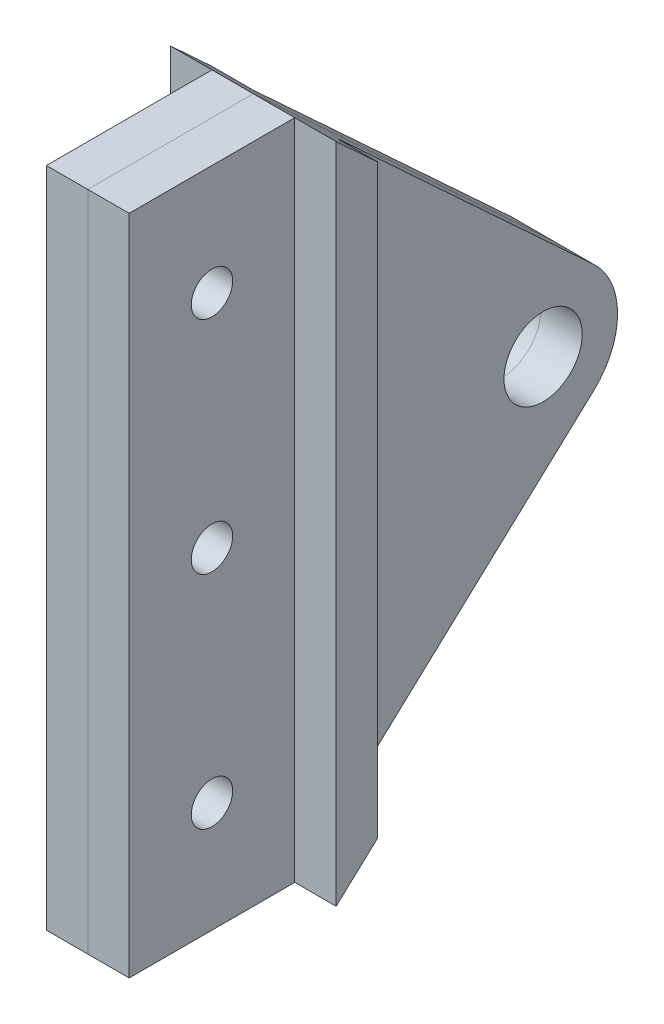
ISO-10303-21;
HEADER;
FILE_DESCRIPTION(('STEP AP214'),'2;1');
FILE_NAME('part.step','',(''),(''),'','','');
FILE_SCHEMA(('AUTOMOTIVE_DESIGN { 1 0 10303 214 1 1 1 1 }'));
ENDSEC;
DATA;
#1=APPLICATION_CONTEXT('core data for automotive mechanical design processes');
#2=APPLICATION_PROTOCOL_DEFINITION('international standard','automotive_design',2000,#1);
#3=PRODUCT_CONTEXT('',#1,'mechanical');
#4=PRODUCT('Part','Part','',(#3));
#5=PRODUCT_RELATED_PRODUCT_CATEGORY('part','',(#4));
#6=PRODUCT_DEFINITION_FORMATION('','',#4);
#7=PRODUCT_DEFINITION_CONTEXT('part definition',#1,'design');
#8=PRODUCT_DEFINITION('design','',#6,#7);
#9=PRODUCT_DEFINITION_SHAPE('','',#8);
#10=(LENGTH_UNIT() NAMED_UNIT(*) SI_UNIT(.MILLI.,.METRE.));
#11=(NAMED_UNIT(*) PLANE_ANGLE_UNIT() SI_UNIT($,.RADIAN.));
#12=(NAMED_UNIT(*) SI_UNIT($,.STERADIAN.) SOLID_ANGLE_UNIT());
#13=UNCERTAINTY_MEASURE_WITH_UNIT(LENGTH_MEASURE(1.E-05),#10,'distance_accuracy_value','');
#14=(GEOMETRIC_REPRESENTATION_CONTEXT(3) GLOBAL_UNCERTAINTY_ASSIGNED_CONTEXT((#13)) GLOBAL_UNIT_ASSIGNED_CONTEXT((#10,
#11,#12)) REPRESENTATION_CONTEXT('',''));
#15=CARTESIAN_POINT('',(0.,0.,0.));
#16=DIRECTION('',(0.,0.,1.));
#17=DIRECTION('',(1.,0.,0.));
#18=AXIS2_PLACEMENT_3D('',#15,#16,#17);
#19=CARTESIAN_POINT('',(-6.35,0.,0.));
#20=DIRECTION('',(-1.,0.,0.));
#21=DIRECTION('',(0.,0.,-1.));
#22=AXIS2_PLACEMENT_3D('',#19,#20,#21);
#23=PLANE('',#22);
#24=CARTESIAN_POINT('',(-6.35,62.6297688444484,-1343.57742326432));
#25=DIRECTION('',(1.,0.,0.));
#26=DIRECTION('',(0.,0.,-1.));
#27=AXIS2_PLACEMENT_3D('',#24,#25,#26);
#28=CIRCLE('',#27,3.17499999999986);
#29=CARTESIAN_POINT('',(-6.35,62.6297688444484,-1346.75242326432));
#30=VERTEX_POINT('',#29);
#31=EDGE_CURVE('E238',#30,#30,#28,.F.);
#32=ORIENTED_EDGE('',*,*,#31,.F.);
#33=EDGE_LOOP('',(#32));
#34=FACE_BOUND('',#33,.T.);
#35=CARTESIAN_POINT('',(-6.35,130.363102177782,-1343.57742326432));
#36=DIRECTION('',(1.,0.,0.));
#37=DIRECTION('',(0.,0.,-1.));
#38=AXIS2_PLACEMENT_3D('',#35,#36,#37);
#39=CIRCLE('',#38,3.17499999999986);
#40=CARTESIAN_POINT('',(-6.35,130.363102177782,-1346.75242326432));
#41=VERTEX_POINT('',#40);
#42=EDGE_CURVE('E440',#41,#41,#39,.T.);
#43=ORIENTED_EDGE('',*,*,#42,.T.);
#44=EDGE_LOOP('',(#43));
#45=FACE_BOUND('',#44,.T.);
#46=CARTESIAN_POINT('',(-6.35,96.4964355111151,-1343.57742326432));
#47=DIRECTION('',(1.,0.,0.));
#48=DIRECTION('',(0.,0.,-1.));
#49=AXIS2_PLACEMENT_3D('',#46,#47,#48);
#50=CIRCLE('',#49,3.17499999999986);
#51=CARTESIAN_POINT('',(-6.35,96.4964355111151,-1346.75242326432));
#52=VERTEX_POINT('',#51);
#53=EDGE_CURVE('E160',#52,#52,#50,.T.);
#54=ORIENTED_EDGE('',*,*,#53,.T.);
#55=EDGE_LOOP('',(#54));
#56=FACE_BOUND('',#55,.T.);
#57=DIRECTION('',(0.,0.,-1.));
#58=VECTOR('',#57,1.);
#59=CARTESIAN_POINT('',(-6.35,45.6964355111143,0.));
#60=LINE('',#59,#58);
#61=CARTESIAN_POINT('',(-6.35,45.6964355111151,-1330.87742326432));
#62=VERTEX_POINT('',#61);
#63=CARTESIAN_POINT('',(-6.35,45.6964355111151,-1356.27742326432));
#64=VERTEX_POINT('',#63);
#65=EDGE_CURVE('E128',#62,#64,#60,.T.);
#66=ORIENTED_EDGE('',*,*,#65,.F.);
#67=DIRECTION('',(0.,-1.,0.));
#68=VECTOR('',#67,1.);
#69=CARTESIAN_POINT('',(-6.35,0.,-1330.87742326432));
#70=LINE('',#69,#68);
#71=CARTESIAN_POINT('',(-6.35,147.296435511115,-1330.87742326432));
#72=VERTEX_POINT('',#71);
#73=EDGE_CURVE('E137',#72,#62,#70,.T.);
#74=ORIENTED_EDGE('',*,*,#73,.F.);
#75=DIRECTION('',(0.,0.,1.));
#76=VECTOR('',#75,1.);
#77=CARTESIAN_POINT('',(-6.35,147.296435511115,0.));
#78=LINE('',#77,#76);
#79=CARTESIAN_POINT('',(-6.35,147.296435511115,-1356.27742326432));
#80=VERTEX_POINT('',#79);
#81=EDGE_CURVE('E144',#80,#72,#78,.T.);
#82=ORIENTED_EDGE('',*,*,#81,.F.);
#83=DIRECTION('',(0.,1.,0.));
#84=VECTOR('',#83,1.);
#85=CARTESIAN_POINT('',(-6.35,0.,-1356.27742326432));
#86=LINE('',#85,#84);
#87=EDGE_CURVE('E148',#64,#80,#86,.T.);
#88=ORIENTED_EDGE('',*,*,#87,.F.);
#89=EDGE_LOOP('',(#66,#74,#82,#88));
#90=FACE_BOUND('',#89,.T.);
#91=ADVANCED_FACE('F53',(#34,#45,#56,#90),#23,.T.);
#92=CARTESIAN_POINT('',(-6.35,96.4964355111151,-1394.37742326432));
#93=DIRECTION('',(1.,0.,0.));
#94=DIRECTION('',(0.,0.,1.));
#95=AXIS2_PLACEMENT_3D('',#92,#93,#94);
#96=CYLINDRICAL_SURFACE('',#95,11.4300000000001);
#97=CARTESIAN_POINT('',(0.,96.4964355111151,-1394.37742326432));
#98=DIRECTION('',(1.,0.,0.));
#99=DIRECTION('',(0.,0.,-1.));
#100=AXIS2_PLACEMENT_3D('',#97,#98,#99);
#101=CIRCLE('',#100,11.4300000000001);
#102=CARTESIAN_POINT('',(0.,88.1045298984414,-1402.13763074788));
#103=VERTEX_POINT('',#102);
#104=CARTESIAN_POINT('',(0.,104.888341123789,-1402.13763074788));
#105=VERTEX_POINT('',#104);
#106=EDGE_CURVE('E254',#103,#105,#101,.T.);
#107=ORIENTED_EDGE('',*,*,#106,.F.);
#108=DIRECTION('',(1.,0.,0.));
#109=VECTOR('',#108,1.);
#110=CARTESIAN_POINT('',(-6.35,88.1045298984414,-1402.13763074788));
#111=LINE('',#110,#109);
#112=CARTESIAN_POINT('',(-6.35,88.1045298984414,-1402.13763074788));
#113=VERTEX_POINT('',#112);
#114=EDGE_CURVE('E235',#113,#103,#111,.T.);
#115=ORIENTED_EDGE('',*,*,#114,.F.);
#116=CARTESIAN_POINT('',(-6.35,96.4964355111151,-1394.37742326432));
#117=DIRECTION('',(1.,0.,0.));
#118=DIRECTION('',(0.,0.,-1.));
#119=AXIS2_PLACEMENT_3D('',#116,#117,#118);
#120=CIRCLE('',#119,11.4300000000001);
#121=CARTESIAN_POINT('',(-6.35,104.888341123789,-1402.13763074788));
#122=VERTEX_POINT('',#121);
#123=EDGE_CURVE('E234',#113,#122,#120,.T.);
#124=ORIENTED_EDGE('',*,*,#123,.T.);
#125=DIRECTION('',(1.,0.,0.));
#126=VECTOR('',#125,1.);
#127=CARTESIAN_POINT('',(-6.35,104.888341123789,-1402.13763074788));
#128=LINE('',#127,#126);
#129=EDGE_CURVE('E12',#122,#105,#128,.T.);
#130=ORIENTED_EDGE('',*,*,#129,.T.);
#131=EDGE_LOOP('',(#107,#115,#124,#130));
#132=FACE_BOUND('',#131,.T.);
#133=ADVANCED_FACE('F55',(#132),#96,.T.);
#134=CARTESIAN_POINT('',(-6.35,755.467484096882,-698.599900221084));
#135=DIRECTION('',(0.,-0.73419996611318,0.678933288150909));
#136=DIRECTION('',(0.,-0.678933288150909,-0.73419996611318));
#137=AXIS2_PLACEMENT_3D('',#134,#135,#136);
#138=PLANE('',#137);
#139=DIRECTION('',(0.,0.678933288150909,0.73419996611318));
#140=VECTOR('',#139,1.);
#141=CARTESIAN_POINT('',(0.,755.467484096882,-698.599900221084));
#142=LINE('',#141,#140);
#143=CARTESIAN_POINT('',(0.,147.296435511115,-1356.27742326432));
#144=VERTEX_POINT('',#143);
#145=EDGE_CURVE('E247',#105,#144,#142,.T.);
#146=ORIENTED_EDGE('',*,*,#145,.F.);
#147=ORIENTED_EDGE('',*,*,#129,.F.);
#148=DIRECTION('',(0.,0.678933288150909,0.73419996611318));
#149=VECTOR('',#148,1.);
#150=CARTESIAN_POINT('',(-6.35,755.467484096882,-698.599900221084));
#151=LINE('',#150,#149);
#152=CARTESIAN_POINT('',(-6.35,141.424429819557,-1362.62742326432));
#153=VERTEX_POINT('',#152);
#154=EDGE_CURVE('E110',#122,#153,#151,.T.);
#155=ORIENTED_EDGE('',*,*,#154,.T.);
#156=DIRECTION('',(1.,0.,0.));
#157=VECTOR('',#156,1.);
#158=CARTESIAN_POINT('',(-12.7,141.424429819557,-1362.62742326432));
#159=LINE('',#158,#157);
#160=CARTESIAN_POINT('',(-12.7,141.424429819557,-1362.62742326432));
#161=VERTEX_POINT('',#160);
#162=EDGE_CURVE('E278',#161,#153,#159,.T.);
#163=ORIENTED_EDGE('',*,*,#162,.F.);
#164=DIRECTION('',(0.,0.678933288150909,0.73419996611318));
#165=VECTOR('',#164,1.);
#166=CARTESIAN_POINT('',(-12.7,755.467484096882,-698.599900221084));
#167=LINE('',#166,#165);
#168=CARTESIAN_POINT('',(-12.7,147.296435511115,-1356.27742326432));
#169=VERTEX_POINT('',#168);
#170=EDGE_CURVE('E297',#161,#169,#167,.T.);
#171=ORIENTED_EDGE('',*,*,#170,.T.);
#172=DIRECTION('',(1.,0.,0.));
#173=VECTOR('',#172,1.);
#174=CARTESIAN_POINT('',(-12.7,147.296435511115,-1356.27742326432));
#175=LINE('',#174,#173);
#176=EDGE_CURVE('E250',#169,#80,#175,.T.);
#177=ORIENTED_EDGE('',*,*,#176,.T.);
#178=DIRECTION('',(1.,0.,0.));
#179=VECTOR('',#178,1.);
#180=CARTESIAN_POINT('',(-6.35,147.296435511115,-1356.27742326432));
#181=LINE('',#180,#179);
#182=EDGE_CURVE('E64',#80,#144,#181,.T.);
#183=ORIENTED_EDGE('',*,*,#182,.T.);
#184=EDGE_LOOP('',(#146,#147,#155,#163,#171,#177,#183));
#185=FACE_BOUND('',#184,.T.);
#186=ADVANCED_FACE('F181',(#185),#138,.F.);
#187=CARTESIAN_POINT('',(-6.35,147.296435511115,0.));
#188=DIRECTION('',(0.,-1.,0.));
#189=DIRECTION('',(0.,0.,-1.));
#190=AXIS2_PLACEMENT_3D('',#187,#188,#189);
#191=PLANE('',#190);
#192=DIRECTION('',(0.,0.,1.));
#193=VECTOR('',#192,1.);
#194=CARTESIAN_POINT('',(0.,147.296435511115,0.));
#195=LINE('',#194,#193);
#196=CARTESIAN_POINT('',(0.,147.296435511115,-1330.87742326432));
#197=VERTEX_POINT('',#196);
#198=EDGE_CURVE('E252',#144,#197,#195,.T.);
#199=ORIENTED_EDGE('',*,*,#198,.F.);
#200=ORIENTED_EDGE('',*,*,#182,.F.);
#201=ORIENTED_EDGE('',*,*,#81,.T.);
#202=DIRECTION('',(1.,0.,0.));
#203=VECTOR('',#202,1.);
#204=CARTESIAN_POINT('',(-6.35,147.296435511115,-1330.87742326432));
#205=LINE('',#204,#203);
#206=EDGE_CURVE('E133',#72,#197,#205,.T.);
#207=ORIENTED_EDGE('',*,*,#206,.T.);
#208=EDGE_LOOP('',(#199,#200,#201,#207));
#209=FACE_BOUND('',#208,.T.);
#210=ADVANCED_FACE('F179',(#209),#191,.F.);
#211=CARTESIAN_POINT('',(-6.35,0.,-1330.87742326432));
#212=DIRECTION('',(0.,0.,-1.));
#213=DIRECTION('',(1.,0.,0.));
#214=AXIS2_PLACEMENT_3D('',#211,#212,#213);
#215=PLANE('',#214);
#216=DIRECTION('',(0.,-1.,0.));
#217=VECTOR('',#216,1.);
#218=CARTESIAN_POINT('',(0.,0.,-1330.87742326432));
#219=LINE('',#218,#217);
#220=CARTESIAN_POINT('',(0.,45.6964355111151,-1330.87742326432));
#221=VERTEX_POINT('',#220);
#222=EDGE_CURVE('E259',#197,#221,#219,.T.);
#223=ORIENTED_EDGE('',*,*,#222,.F.);
#224=ORIENTED_EDGE('',*,*,#206,.F.);
#225=ORIENTED_EDGE('',*,*,#73,.T.);
#226=DIRECTION('',(1.,0.,0.));
#227=VECTOR('',#226,1.);
#228=CARTESIAN_POINT('',(-6.35,45.6964355111151,-1330.87742326432));
#229=LINE('',#228,#227);
#230=EDGE_CURVE('E123',#62,#221,#229,.T.);
#231=ORIENTED_EDGE('',*,*,#230,.T.);
#232=EDGE_LOOP('',(#223,#224,#225,#231));
#233=FACE_BOUND('',#232,.T.);
#234=ADVANCED_FACE('F138',(#233),#215,.F.);
#235=CARTESIAN_POINT('',(-6.35,45.6964355111143,0.));
#236=DIRECTION('',(0.,1.,0.));
#237=DIRECTION('',(0.,0.,1.));
#238=AXIS2_PLACEMENT_3D('',#235,#236,#237);
#239=PLANE('',#238);
#240=DIRECTION('',(0.,0.,-1.));
#241=VECTOR('',#240,1.);
#242=CARTESIAN_POINT('',(0.,45.6964355111143,0.));
#243=LINE('',#242,#241);
#244=CARTESIAN_POINT('',(0.,45.6964355111151,-1356.27742326432));
#245=VERTEX_POINT('',#244);
#246=EDGE_CURVE('E129',#221,#245,#243,.T.);
#247=ORIENTED_EDGE('',*,*,#246,.F.);
#248=ORIENTED_EDGE('',*,*,#230,.F.);
#249=ORIENTED_EDGE('',*,*,#65,.T.);
#250=DIRECTION('',(1.,0.,0.));
#251=VECTOR('',#250,1.);
#252=CARTESIAN_POINT('',(-6.35,45.6964355111151,-1356.27742326432));
#253=LINE('',#252,#251);
#254=EDGE_CURVE('E134',#64,#245,#253,.T.);
#255=ORIENTED_EDGE('',*,*,#254,.T.);
#256=EDGE_LOOP('',(#247,#248,#249,#255));
#257=FACE_BOUND('',#256,.T.);
#258=ADVANCED_FACE('F125',(#257),#239,.F.);
#259=CARTESIAN_POINT('',(-6.35,130.363102177782,-1343.57742326432));
#260=DIRECTION('',(1.,0.,0.));
#261=DIRECTION('',(0.,0.,1.));
#262=AXIS2_PLACEMENT_3D('',#259,#260,#261);
#263=CYLINDRICAL_SURFACE('',#262,3.17499999999986);
#264=ORIENTED_EDGE('',*,*,#42,.F.);
#265=EDGE_LOOP('',(#264));
#266=FACE_BOUND('',#265,.T.);
#267=CARTESIAN_POINT('',(0.,130.363102177782,-1343.57742326432));
#268=DIRECTION('',(1.,0.,0.));
#269=DIRECTION('',(0.,0.,-1.));
#270=AXIS2_PLACEMENT_3D('',#267,#268,#269);
#271=CIRCLE('',#270,3.17499999999986);
#272=CARTESIAN_POINT('',(0.,130.363102177782,-1346.75242326432));
#273=VERTEX_POINT('',#272);
#274=EDGE_CURVE('E221',#273,#273,#271,.T.);
#275=ORIENTED_EDGE('',*,*,#274,.T.);
#276=EDGE_LOOP('',(#275));
#277=FACE_BOUND('',#276,.T.);
#278=ADVANCED_FACE('F176',(#266,#277),#263,.F.);
#279=CARTESIAN_POINT('',(-6.35,96.4964355111151,-1343.57742326432));
#280=DIRECTION('',(1.,0.,0.));
#281=DIRECTION('',(0.,0.,1.));
#282=AXIS2_PLACEMENT_3D('',#279,#280,#281);
#283=CYLINDRICAL_SURFACE('',#282,3.17499999999986);
#284=ORIENTED_EDGE('',*,*,#53,.F.);
#285=EDGE_LOOP('',(#284));
#286=FACE_BOUND('',#285,.T.);
#287=CARTESIAN_POINT('',(0.,96.4964355111151,-1343.57742326432));
#288=DIRECTION('',(1.,0.,0.));
#289=DIRECTION('',(0.,0.,-1.));
#290=AXIS2_PLACEMENT_3D('',#287,#288,#289);
#291=CIRCLE('',#290,3.17499999999986);
#292=CARTESIAN_POINT('',(0.,96.4964355111151,-1346.75242326432));
#293=VERTEX_POINT('',#292);
#294=EDGE_CURVE('E216',#293,#293,#291,.T.);
#295=ORIENTED_EDGE('',*,*,#294,.T.);
#296=EDGE_LOOP('',(#295));
#297=FACE_BOUND('',#296,.T.);
#298=ADVANCED_FACE('F168',(#286,#297),#283,.F.);
#299=CARTESIAN_POINT('',(-6.35,96.4964355111151,-1394.37742326432));
#300=DIRECTION('',(1.,0.,0.));
#301=DIRECTION('',(0.,0.,1.));
#302=AXIS2_PLACEMENT_3D('',#299,#300,#301);
#303=ELLIPSE('',#302,6.00000000000001,5.99977153838503);
#304=DIRECTION('',(1.,0.,0.));
#305=VECTOR('',#304,1.);
#306=SURFACE_OF_LINEAR_EXTRUSION('',#303,#305);
#307=CARTESIAN_POINT('',(-6.35,96.496435511115,-1388.37742326432));
#308=VERTEX_POINT('',#307);
#309=EDGE_CURVE('E152',#308,#308,#303,.T.);
#310=ORIENTED_EDGE('',*,*,#309,.F.);
#311=EDGE_LOOP('',(#310));
#312=FACE_BOUND('',#311,.T.);
#313=CARTESIAN_POINT('',(0.,96.4964355111151,-1394.37742326432));
#314=DIRECTION('',(1.,0.,0.));
#315=DIRECTION('',(0.,0.,1.));
#316=AXIS2_PLACEMENT_3D('',#313,#314,#315);
#317=ELLIPSE('',#316,6.00000000000001,5.99977153838503);
#318=CARTESIAN_POINT('',(0.,96.496435511115,-1388.37742326432));
#319=VERTEX_POINT('',#318);
#320=EDGE_CURVE('E213',#319,#319,#317,.T.);
#321=ORIENTED_EDGE('',*,*,#320,.T.);
#322=EDGE_LOOP('',(#321));
#323=FACE_BOUND('',#322,.T.);
#324=ADVANCED_FACE('F163',(#312,#323),#306,.F.);
#325=CARTESIAN_POINT('',(-6.35,-651.434756052993,-602.398203971947));
#326=DIRECTION('',(0.,0.73419996611318,0.678933288150909));
#327=DIRECTION('',(0.,-0.678933288150909,0.73419996611318));
#328=AXIS2_PLACEMENT_3D('',#325,#326,#327);
#329=PLANE('',#328);
#330=DIRECTION('',(0.,0.678933288150909,-0.73419996611318));
#331=VECTOR('',#330,1.);
#332=CARTESIAN_POINT('',(-6.35,-651.434756052993,-602.398203971947));
#333=LINE('',#332,#331);
#334=CARTESIAN_POINT('',(-6.35,51.568441202673,-1362.62742326432));
#335=VERTEX_POINT('',#334);
#336=EDGE_CURVE('E57',#335,#113,#333,.T.);
#337=ORIENTED_EDGE('',*,*,#336,.T.);
#338=ORIENTED_EDGE('',*,*,#114,.T.);
#339=DIRECTION('',(0.,0.678933288150909,-0.73419996611318));
#340=VECTOR('',#339,1.);
#341=CARTESIAN_POINT('',(0.,-651.434756052993,-602.398203971947));
#342=LINE('',#341,#340);
#343=EDGE_CURVE('E106',#245,#103,#342,.T.);
#344=ORIENTED_EDGE('',*,*,#343,.F.);
#345=ORIENTED_EDGE('',*,*,#254,.F.);
#346=DIRECTION('',(1.,0.,0.));
#347=VECTOR('',#346,1.);
#348=CARTESIAN_POINT('',(-12.7,45.6964355111151,-1356.27742326432));
#349=LINE('',#348,#347);
#350=CARTESIAN_POINT('',(-12.7,45.6964355111151,-1356.27742326432));
#351=VERTEX_POINT('',#350);
#352=EDGE_CURVE('E283',#351,#64,#349,.T.);
#353=ORIENTED_EDGE('',*,*,#352,.F.);
#354=DIRECTION('',(0.,0.678933288150909,-0.73419996611318));
#355=VECTOR('',#354,1.);
#356=CARTESIAN_POINT('',(-12.7,-651.434756052993,-602.398203971947));
#357=LINE('',#356,#355);
#358=CARTESIAN_POINT('',(-12.7,51.568441202673,-1362.62742326432));
#359=VERTEX_POINT('',#358);
#360=EDGE_CURVE('E289',#351,#359,#357,.T.);
#361=ORIENTED_EDGE('',*,*,#360,.T.);
#362=DIRECTION('',(1.,0.,0.));
#363=VECTOR('',#362,1.);
#364=CARTESIAN_POINT('',(-12.7,51.568441202673,-1362.62742326432));
#365=LINE('',#364,#363);
#366=EDGE_CURVE('E286',#359,#335,#365,.T.);
#367=ORIENTED_EDGE('',*,*,#366,.T.);
#368=EDGE_LOOP('',(#337,#338,#344,#345,#353,#361,#367));
#369=FACE_BOUND('',#368,.T.);
#370=ADVANCED_FACE('F167',(#369),#329,.F.);
#371=CARTESIAN_POINT('',(-6.35,62.6297688444484,-1343.57742326432));
#372=DIRECTION('',(1.,0.,0.));
#373=DIRECTION('',(0.,0.,1.));
#374=AXIS2_PLACEMENT_3D('',#371,#372,#373);
#375=CYLINDRICAL_SURFACE('',#374,3.17499999999986);
#376=ORIENTED_EDGE('',*,*,#31,.T.);
#377=EDGE_LOOP('',(#376));
#378=FACE_BOUND('',#377,.T.);
#379=CARTESIAN_POINT('',(0.,62.6297688444484,-1343.57742326432));
#380=DIRECTION('',(1.,0.,0.));
#381=DIRECTION('',(0.,0.,-1.));
#382=AXIS2_PLACEMENT_3D('',#379,#380,#381);
#383=CIRCLE('',#382,3.17499999999986);
#384=CARTESIAN_POINT('',(0.,62.6297688444484,-1346.75242326432));
#385=VERTEX_POINT('',#384);
#386=EDGE_CURVE('E230',#385,#385,#383,.F.);
#387=ORIENTED_EDGE('',*,*,#386,.F.);
#388=EDGE_LOOP('',(#387));
#389=FACE_BOUND('',#388,.T.);
#390=ADVANCED_FACE('F173',(#378,#389),#375,.F.);
#391=DIRECTION('',(0.,1.,0.));
#392=VECTOR('',#391,1.);
#393=CARTESIAN_POINT('',(-6.35,0.,-1362.62742326432));
#394=LINE('',#393,#392);
#395=EDGE_CURVE('E71',#335,#153,#394,.T.);
#396=ORIENTED_EDGE('',*,*,#395,.T.);
#397=ORIENTED_EDGE('',*,*,#154,.F.);
#398=ORIENTED_EDGE('',*,*,#123,.F.);
#399=ORIENTED_EDGE('',*,*,#336,.F.);
#400=EDGE_LOOP('',(#396,#397,#398,#399));
#401=FACE_BOUND('',#400,.T.);
#402=ORIENTED_EDGE('',*,*,#309,.T.);
#403=EDGE_LOOP('',(#402));
#404=FACE_BOUND('',#403,.T.);
#405=ADVANCED_FACE('F192',(#401,#404),#23,.T.);
#406=CARTESIAN_POINT('',(0.,0.,0.));
#407=DIRECTION('',(-1.,0.,0.));
#408=DIRECTION('',(0.,0.,-1.));
#409=AXIS2_PLACEMENT_3D('',#406,#407,#408);
#410=PLANE('',#409);
#411=ORIENTED_EDGE('',*,*,#106,.T.);
#412=ORIENTED_EDGE('',*,*,#145,.T.);
#413=ORIENTED_EDGE('',*,*,#198,.T.);
#414=ORIENTED_EDGE('',*,*,#222,.T.);
#415=ORIENTED_EDGE('',*,*,#246,.T.);
#416=ORIENTED_EDGE('',*,*,#343,.T.);
#417=EDGE_LOOP('',(#411,#412,#413,#414,#415,#416));
#418=FACE_BOUND('',#417,.T.);
#419=ORIENTED_EDGE('',*,*,#320,.F.);
#420=EDGE_LOOP('',(#419));
#421=FACE_BOUND('',#420,.T.);
#422=ORIENTED_EDGE('',*,*,#386,.T.);
#423=EDGE_LOOP('',(#422));
#424=FACE_BOUND('',#423,.T.);
#425=ORIENTED_EDGE('',*,*,#274,.F.);
#426=EDGE_LOOP('',(#425));
#427=FACE_BOUND('',#426,.T.);
#428=ORIENTED_EDGE('',*,*,#294,.F.);
#429=EDGE_LOOP('',(#428));
#430=FACE_BOUND('',#429,.T.);
#431=ADVANCED_FACE('F200',(#418,#421,#424,#427,#430),#410,.F.);
#432=CARTESIAN_POINT('',(-12.7,0.,-1362.62742326432));
#433=DIRECTION('',(0.,0.,-1.));
#434=DIRECTION('',(1.,0.,0.));
#435=AXIS2_PLACEMENT_3D('',#432,#433,#434);
#436=PLANE('',#435);
#437=ORIENTED_EDGE('',*,*,#366,.F.);
#438=DIRECTION('',(0.,-1.,0.));
#439=VECTOR('',#438,1.);
#440=CARTESIAN_POINT('',(-12.7,0.,-1362.62742326432));
#441=LINE('',#440,#439);
#442=EDGE_CURVE('E300',#161,#359,#441,.T.);
#443=ORIENTED_EDGE('',*,*,#442,.F.);
#444=ORIENTED_EDGE('',*,*,#162,.T.);
#445=ORIENTED_EDGE('',*,*,#395,.F.);
#446=EDGE_LOOP('',(#437,#443,#444,#445));
#447=FACE_BOUND('',#446,.T.);
#448=ADVANCED_FACE('F205',(#447),#436,.T.);
#449=CARTESIAN_POINT('',(-12.7,0.,-1356.27742326432));
#450=DIRECTION('',(0.,0.,-1.));
#451=DIRECTION('',(1.,0.,0.));
#452=AXIS2_PLACEMENT_3D('',#449,#450,#451);
#453=PLANE('',#452);
#454=ORIENTED_EDGE('',*,*,#87,.T.);
#455=ORIENTED_EDGE('',*,*,#176,.F.);
#456=DIRECTION('',(0.,-1.,0.));
#457=VECTOR('',#456,1.);
#458=CARTESIAN_POINT('',(-12.7,0.,-1356.27742326432));
#459=LINE('',#458,#457);
#460=EDGE_CURVE('E293',#169,#351,#459,.T.);
#461=ORIENTED_EDGE('',*,*,#460,.T.);
#462=ORIENTED_EDGE('',*,*,#352,.T.);
#463=EDGE_LOOP('',(#454,#455,#461,#462));
#464=FACE_BOUND('',#463,.T.);
#465=ADVANCED_FACE('F320',(#464),#453,.F.);
#466=CARTESIAN_POINT('',(-12.7,0.,0.));
#467=DIRECTION('',(-1.,0.,0.));
#468=DIRECTION('',(0.,0.,-1.));
#469=AXIS2_PLACEMENT_3D('',#466,#467,#468);
#470=PLANE('',#469);
#471=ORIENTED_EDGE('',*,*,#442,.T.);
#472=ORIENTED_EDGE('',*,*,#360,.F.);
#473=ORIENTED_EDGE('',*,*,#460,.F.);
#474=ORIENTED_EDGE('',*,*,#170,.F.);
#475=EDGE_LOOP('',(#471,#472,#473,#474));
#476=FACE_BOUND('',#475,.T.);
#477=ADVANCED_FACE('F309',(#476),#470,.T.);
#478=CLOSED_SHELL('',(#91,#133,#186,#210,#234,#258,#278,#298,#324,#370,#390,#405,#431,#448,#465,#477));
#479=MANIFOLD_SOLID_BREP('B2',#478);
#480=CARTESIAN_POINT('',(6.35,0.,0.));
#481=DIRECTION('',(1.,0.,0.));
#482=DIRECTION('',(0.,0.,-1.));
#483=AXIS2_PLACEMENT_3D('',#480,#481,#482);
#484=PLANE('',#483);
#485=CARTESIAN_POINT('',(6.35,62.6297688444484,-1343.57742326432));
#486=DIRECTION('',(1.,0.,0.));
#487=DIRECTION('',(0.,0.,-1.));
#488=AXIS2_PLACEMENT_3D('',#485,#486,#487);
#489=CIRCLE('',#488,3.17499999999986);
#490=CARTESIAN_POINT('',(6.35,62.6297688444484,-1346.75242326432));
#491=VERTEX_POINT('',#490);
#492=EDGE_CURVE('E677',#491,#491,#489,.F.);
#493=ORIENTED_EDGE('',*,*,#492,.T.);
#494=EDGE_LOOP('',(#493));
#495=FACE_BOUND('',#494,.T.);
#496=CARTESIAN_POINT('',(6.35,130.363102177782,-1343.57742326432));
#497=DIRECTION('',(1.,0.,0.));
#498=DIRECTION('',(0.,0.,-1.));
#499=AXIS2_PLACEMENT_3D('',#496,#497,#498);
#500=CIRCLE('',#499,3.17499999999986);
#501=CARTESIAN_POINT('',(6.35,130.363102177782,-1346.75242326432));
#502=VERTEX_POINT('',#501);
#503=EDGE_CURVE('E703',#502,#502,#500,.T.);
#504=ORIENTED_EDGE('',*,*,#503,.F.);
#505=EDGE_LOOP('',(#504));
#506=FACE_BOUND('',#505,.T.);
#507=CARTESIAN_POINT('',(6.35,96.4964355111151,-1343.57742326432));
#508=DIRECTION('',(1.,0.,0.));
#509=DIRECTION('',(0.,0.,-1.));
#510=AXIS2_PLACEMENT_3D('',#507,#508,#509);
#511=CIRCLE('',#510,3.17499999999986);
#512=CARTESIAN_POINT('',(6.35,96.4964355111151,-1346.75242326432));
#513=VERTEX_POINT('',#512);
#514=EDGE_CURVE('E602',#513,#513,#511,.T.);
#515=ORIENTED_EDGE('',*,*,#514,.F.);
#516=EDGE_LOOP('',(#515));
#517=FACE_BOUND('',#516,.T.);
#518=DIRECTION('',(0.,0.,-1.));
#519=VECTOR('',#518,1.);
#520=CARTESIAN_POINT('',(6.35,45.6964355111143,0.));
#521=LINE('',#520,#519);
#522=CARTESIAN_POINT('',(6.35,45.6964355111151,-1330.87742326432));
#523=VERTEX_POINT('',#522);
#524=CARTESIAN_POINT('',(6.35,45.6964355111151,-1356.27742326432));
#525=VERTEX_POINT('',#524);
#526=EDGE_CURVE('E574',#523,#525,#521,.T.);
#527=ORIENTED_EDGE('',*,*,#526,.T.);
#528=DIRECTION('',(0.,1.,0.));
#529=VECTOR('',#528,1.);
#530=CARTESIAN_POINT('',(6.35,0.,-1356.27742326432));
#531=LINE('',#530,#529);
#532=CARTESIAN_POINT('',(6.35,147.296435511115,-1356.27742326432));
#533=VERTEX_POINT('',#532);
#534=EDGE_CURVE('E700',#525,#533,#531,.T.);
#535=ORIENTED_EDGE('',*,*,#534,.T.);
#536=DIRECTION('',(0.,0.,1.));
#537=VECTOR('',#536,1.);
#538=CARTESIAN_POINT('',(6.35,147.296435511115,0.));
#539=LINE('',#538,#537);
#540=CARTESIAN_POINT('',(6.35,147.296435511115,-1330.87742326432));
#541=VERTEX_POINT('',#540);
#542=EDGE_CURVE('E577',#533,#541,#539,.T.);
#543=ORIENTED_EDGE('',*,*,#542,.T.);
#544=DIRECTION('',(0.,-1.,0.));
#545=VECTOR('',#544,1.);
#546=CARTESIAN_POINT('',(6.35,0.,-1330.87742326432));
#547=LINE('',#546,#545);
#548=EDGE_CURVE('E571',#541,#523,#547,.T.);
#549=ORIENTED_EDGE('',*,*,#548,.T.);
#550=EDGE_LOOP('',(#527,#535,#543,#549));
#551=FACE_BOUND('',#550,.T.);
#552=ADVANCED_FACE('F505',(#495,#506,#517,#551),#484,.T.);
#553=CARTESIAN_POINT('',(6.35,96.4964355111151,-1394.37742326432));
#554=DIRECTION('',(-1.,0.,0.));
#555=DIRECTION('',(0.,0.,1.));
#556=AXIS2_PLACEMENT_3D('',#553,#554,#555);
#557=CYLINDRICAL_SURFACE('',#556,11.4300000000001);
#558=CARTESIAN_POINT('',(0.,96.4964355111151,-1394.37742326432));
#559=DIRECTION('',(1.,0.,0.));
#560=DIRECTION('',(0.,0.,-1.));
#561=AXIS2_PLACEMENT_3D('',#558,#559,#560);
#562=CIRCLE('',#561,11.4300000000001);
#563=CARTESIAN_POINT('',(0.,88.1045298984414,-1402.13763074788));
#564=VERTEX_POINT('',#563);
#565=CARTESIAN_POINT('',(0.,104.888341123789,-1402.13763074788));
#566=VERTEX_POINT('',#565);
#567=EDGE_CURVE('E690',#564,#566,#562,.T.);
#568=ORIENTED_EDGE('',*,*,#567,.T.);
#569=DIRECTION('',(-1.,0.,0.));
#570=VECTOR('',#569,1.);
#571=CARTESIAN_POINT('',(6.35,104.888341123789,-1402.13763074788));
#572=LINE('',#571,#570);
#573=CARTESIAN_POINT('',(6.35,104.888341123789,-1402.13763074788));
#574=VERTEX_POINT('',#573);
#575=EDGE_CURVE('E51',#574,#566,#572,.T.);
#576=ORIENTED_EDGE('',*,*,#575,.F.);
#577=CARTESIAN_POINT('',(6.35,96.4964355111151,-1394.37742326432));
#578=DIRECTION('',(1.,0.,0.));
#579=DIRECTION('',(0.,0.,-1.));
#580=AXIS2_PLACEMENT_3D('',#577,#578,#579);
#581=CIRCLE('',#580,11.4300000000001);
#582=CARTESIAN_POINT('',(6.35,88.1045298984414,-1402.13763074788));
#583=VERTEX_POINT('',#582);
#584=EDGE_CURVE('E674',#583,#574,#581,.T.);
#585=ORIENTED_EDGE('',*,*,#584,.F.);
#586=DIRECTION('',(-1.,0.,0.));
#587=VECTOR('',#586,1.);
#588=CARTESIAN_POINT('',(6.35,88.1045298984414,-1402.13763074788));
#589=LINE('',#588,#587);
#590=EDGE_CURVE('E675',#583,#564,#589,.T.);
#591=ORIENTED_EDGE('',*,*,#590,.T.);
#592=EDGE_LOOP('',(#568,#576,#585,#591));
#593=FACE_BOUND('',#592,.T.);
#594=ADVANCED_FACE('F507',(#593),#557,.T.);
#595=CARTESIAN_POINT('',(6.35,755.467484096882,-698.599900221084));
#596=DIRECTION('',(0.,-0.73419996611318,0.678933288150909));
#597=DIRECTION('',(0.,-0.678933288150909,-0.73419996611318));
#598=AXIS2_PLACEMENT_3D('',#595,#596,#597);
#599=PLANE('',#598);
#600=DIRECTION('',(0.,0.678933288150909,0.73419996611318));
#601=VECTOR('',#600,1.);
#602=CARTESIAN_POINT('',(0.,755.467484096882,-698.599900221084));
#603=LINE('',#602,#601);
#604=CARTESIAN_POINT('',(0.,147.296435511115,-1356.27742326432));
#605=VERTEX_POINT('',#604);
#606=EDGE_CURVE('E687',#566,#605,#603,.T.);
#607=ORIENTED_EDGE('',*,*,#606,.T.);
#608=DIRECTION('',(-1.,0.,0.));
#609=VECTOR('',#608,1.);
#610=CARTESIAN_POINT('',(6.35,147.296435511115,-1356.27742326432));
#611=LINE('',#610,#609);
#612=EDGE_CURVE('E515',#533,#605,#611,.T.);
#613=ORIENTED_EDGE('',*,*,#612,.F.);
#614=DIRECTION('',(-1.,0.,0.));
#615=VECTOR('',#614,1.);
#616=CARTESIAN_POINT('',(12.7,147.296435511115,-1356.27742326432));
#617=LINE('',#616,#615);
#618=CARTESIAN_POINT('',(12.7,147.296435511115,-1356.27742326432));
#619=VERTEX_POINT('',#618);
#620=EDGE_CURVE('E846',#619,#533,#617,.T.);
#621=ORIENTED_EDGE('',*,*,#620,.F.);
#622=DIRECTION('',(0.,0.678933288150909,0.73419996611318));
#623=VECTOR('',#622,1.);
#624=CARTESIAN_POINT('',(12.7,755.467484096882,-698.599900221084));
#625=LINE('',#624,#623);
#626=CARTESIAN_POINT('',(12.7,141.424429819557,-1362.62742326432));
#627=VERTEX_POINT('',#626);
#628=EDGE_CURVE('E831',#627,#619,#625,.T.);
#629=ORIENTED_EDGE('',*,*,#628,.F.);
#630=DIRECTION('',(-1.,0.,0.));
#631=VECTOR('',#630,1.);
#632=CARTESIAN_POINT('',(12.7,141.424429819557,-1362.62742326432));
#633=LINE('',#632,#631);
#634=CARTESIAN_POINT('',(6.35,141.424429819557,-1362.62742326432));
#635=VERTEX_POINT('',#634);
#636=EDGE_CURVE('E848',#627,#635,#633,.T.);
#637=ORIENTED_EDGE('',*,*,#636,.T.);
#638=DIRECTION('',(0.,0.678933288150909,0.73419996611318));
#639=VECTOR('',#638,1.);
#640=CARTESIAN_POINT('',(6.35,755.467484096882,-698.599900221084));
#641=LINE('',#640,#639);
#642=EDGE_CURVE('E522',#574,#635,#641,.T.);
#643=ORIENTED_EDGE('',*,*,#642,.F.);
#644=ORIENTED_EDGE('',*,*,#575,.T.);
#645=EDGE_LOOP('',(#607,#613,#621,#629,#637,#643,#644));
#646=FACE_BOUND('',#645,.T.);
#647=ADVANCED_FACE('F623',(#646),#599,.F.);
#648=CARTESIAN_POINT('',(6.35,147.296435511115,0.));
#649=DIRECTION('',(0.,-1.,0.));
#650=DIRECTION('',(0.,0.,-1.));
#651=AXIS2_PLACEMENT_3D('',#648,#649,#650);
#652=PLANE('',#651);
#653=DIRECTION('',(0.,0.,1.));
#654=VECTOR('',#653,1.);
#655=CARTESIAN_POINT('',(0.,147.296435511115,0.));
#656=LINE('',#655,#654);
#657=CARTESIAN_POINT('',(0.,147.296435511115,-1330.87742326432));
#658=VERTEX_POINT('',#657);
#659=EDGE_CURVE('E683',#605,#658,#656,.T.);
#660=ORIENTED_EDGE('',*,*,#659,.T.);
#661=DIRECTION('',(-1.,0.,0.));
#662=VECTOR('',#661,1.);
#663=CARTESIAN_POINT('',(6.35,147.296435511115,-1330.87742326432));
#664=LINE('',#663,#662);
#665=EDGE_CURVE('E589',#541,#658,#664,.T.);
#666=ORIENTED_EDGE('',*,*,#665,.F.);
#667=ORIENTED_EDGE('',*,*,#542,.F.);
#668=ORIENTED_EDGE('',*,*,#612,.T.);
#669=EDGE_LOOP('',(#660,#666,#667,#668));
#670=FACE_BOUND('',#669,.T.);
#671=ADVANCED_FACE('F621',(#670),#652,.F.);
#672=CARTESIAN_POINT('',(6.35,0.,-1330.87742326432));
#673=DIRECTION('',(0.,0.,-1.));
#674=DIRECTION('',(-1.,0.,0.));
#675=AXIS2_PLACEMENT_3D('',#672,#673,#674);
#676=PLANE('',#675);
#677=DIRECTION('',(0.,-1.,0.));
#678=VECTOR('',#677,1.);
#679=CARTESIAN_POINT('',(0.,0.,-1330.87742326432));
#680=LINE('',#679,#678);
#681=CARTESIAN_POINT('',(0.,45.6964355111151,-1330.87742326432));
#682=VERTEX_POINT('',#681);
#683=EDGE_CURVE('E586',#658,#682,#680,.T.);
#684=ORIENTED_EDGE('',*,*,#683,.T.);
#685=DIRECTION('',(-1.,0.,0.));
#686=VECTOR('',#685,1.);
#687=CARTESIAN_POINT('',(6.35,45.6964355111151,-1330.87742326432));
#688=LINE('',#687,#686);
#689=EDGE_CURVE('E583',#523,#682,#688,.T.);
#690=ORIENTED_EDGE('',*,*,#689,.F.);
#691=ORIENTED_EDGE('',*,*,#548,.F.);
#692=ORIENTED_EDGE('',*,*,#665,.T.);
#693=EDGE_LOOP('',(#684,#690,#691,#692));
#694=FACE_BOUND('',#693,.T.);
#695=ADVANCED_FACE('F584',(#694),#676,.F.);
#696=CARTESIAN_POINT('',(6.35,45.6964355111143,0.));
#697=DIRECTION('',(0.,1.,0.));
#698=DIRECTION('',(0.,0.,1.));
#699=AXIS2_PLACEMENT_3D('',#696,#697,#698);
#700=PLANE('',#699);
#701=DIRECTION('',(0.,0.,-1.));
#702=VECTOR('',#701,1.);
#703=CARTESIAN_POINT('',(0.,45.6964355111143,0.));
#704=LINE('',#703,#702);
#705=CARTESIAN_POINT('',(0.,45.6964355111151,-1356.27742326432));
#706=VERTEX_POINT('',#705);
#707=EDGE_CURVE('E664',#682,#706,#704,.T.);
#708=ORIENTED_EDGE('',*,*,#707,.T.);
#709=DIRECTION('',(-1.,0.,0.));
#710=VECTOR('',#709,1.);
#711=CARTESIAN_POINT('',(6.35,45.6964355111151,-1356.27742326432));
#712=LINE('',#711,#710);
#713=EDGE_CURVE('E590',#525,#706,#712,.T.);
#714=ORIENTED_EDGE('',*,*,#713,.F.);
#715=ORIENTED_EDGE('',*,*,#526,.F.);
#716=ORIENTED_EDGE('',*,*,#689,.T.);
#717=EDGE_LOOP('',(#708,#714,#715,#716));
#718=FACE_BOUND('',#717,.T.);
#719=ADVANCED_FACE('F592',(#718),#700,.F.);
#720=CARTESIAN_POINT('',(6.35,130.363102177782,-1343.57742326432));
#721=DIRECTION('',(-1.,0.,0.));
#722=DIRECTION('',(0.,0.,1.));
#723=AXIS2_PLACEMENT_3D('',#720,#721,#722);
#724=CYLINDRICAL_SURFACE('',#723,3.17499999999986);
#725=ORIENTED_EDGE('',*,*,#503,.T.);
#726=EDGE_LOOP('',(#725));
#727=FACE_BOUND('',#726,.T.);
#728=CARTESIAN_POINT('',(0.,130.363102177782,-1343.57742326432));
#729=DIRECTION('',(1.,0.,0.));
#730=DIRECTION('',(0.,0.,-1.));
#731=AXIS2_PLACEMENT_3D('',#728,#729,#730);
#732=CIRCLE('',#731,3.17499999999986);
#733=CARTESIAN_POINT('',(0.,130.363102177782,-1346.75242326432));
#734=VERTEX_POINT('',#733);
#735=EDGE_CURVE('E662',#734,#734,#732,.T.);
#736=ORIENTED_EDGE('',*,*,#735,.F.);
#737=EDGE_LOOP('',(#736));
#738=FACE_BOUND('',#737,.T.);
#739=ADVANCED_FACE('F618',(#727,#738),#724,.F.);
#740=CARTESIAN_POINT('',(6.35,96.4964355111151,-1343.57742326432));
#741=DIRECTION('',(-1.,0.,0.));
#742=DIRECTION('',(0.,0.,1.));
#743=AXIS2_PLACEMENT_3D('',#740,#741,#742);
#744=CYLINDRICAL_SURFACE('',#743,3.17499999999986);
#745=ORIENTED_EDGE('',*,*,#514,.T.);
#746=EDGE_LOOP('',(#745));
#747=FACE_BOUND('',#746,.T.);
#748=CARTESIAN_POINT('',(0.,96.4964355111151,-1343.57742326432));
#749=DIRECTION('',(1.,0.,0.));
#750=DIRECTION('',(0.,0.,-1.));
#751=AXIS2_PLACEMENT_3D('',#748,#749,#750);
#752=CIRCLE('',#751,3.17499999999986);
#753=CARTESIAN_POINT('',(0.,96.4964355111151,-1346.75242326432));
#754=VERTEX_POINT('',#753);
#755=EDGE_CURVE('E659',#754,#754,#752,.T.);
#756=ORIENTED_EDGE('',*,*,#755,.F.);
#757=EDGE_LOOP('',(#756));
#758=FACE_BOUND('',#757,.T.);
#759=ADVANCED_FACE('F610',(#747,#758),#744,.F.);
#760=CARTESIAN_POINT('',(6.35,96.4964355111151,-1394.37742326432));
#761=DIRECTION('',(1.,0.,0.));
#762=DIRECTION('',(0.,0.,1.));
#763=AXIS2_PLACEMENT_3D('',#760,#761,#762);
#764=ELLIPSE('',#763,6.00000000000001,5.99977153838503);
#765=DIRECTION('',(-1.,0.,0.));
#766=VECTOR('',#765,1.);
#767=SURFACE_OF_LINEAR_EXTRUSION('',#764,#766);
#768=CARTESIAN_POINT('',(6.35,96.496435511115,-1388.37742326432));
#769=VERTEX_POINT('',#768);
#770=EDGE_CURVE('E595',#769,#769,#764,.T.);
#771=ORIENTED_EDGE('',*,*,#770,.T.);
#772=EDGE_LOOP('',(#771));
#773=FACE_BOUND('',#772,.T.);
#774=CARTESIAN_POINT('',(0.,96.4964355111151,-1394.37742326432));
#775=DIRECTION('',(1.,0.,0.));
#776=DIRECTION('',(0.,0.,1.));
#777=AXIS2_PLACEMENT_3D('',#774,#775,#776);
#778=ELLIPSE('',#777,6.00000000000001,5.99977153838503);
#779=CARTESIAN_POINT('',(0.,96.496435511115,-1388.37742326432));
#780=VERTEX_POINT('',#779);
#781=EDGE_CURVE('E657',#780,#780,#778,.T.);
#782=ORIENTED_EDGE('',*,*,#781,.F.);
#783=EDGE_LOOP('',(#782));
#784=FACE_BOUND('',#783,.T.);
#785=ADVANCED_FACE('F605',(#773,#784),#767,.T.);
#786=CARTESIAN_POINT('',(6.35,-651.434756052993,-602.398203971947));
#787=DIRECTION('',(0.,0.73419996611318,0.678933288150909));
#788=DIRECTION('',(0.,-0.678933288150909,0.73419996611318));
#789=AXIS2_PLACEMENT_3D('',#786,#787,#788);
#790=PLANE('',#789);
#791=DIRECTION('',(0.,0.678933288150909,-0.73419996611318));
#792=VECTOR('',#791,1.);
#793=CARTESIAN_POINT('',(6.35,-651.434756052993,-602.398203971947));
#794=LINE('',#793,#792);
#795=CARTESIAN_POINT('',(6.35,51.568441202673,-1362.62742326432));
#796=VERTEX_POINT('',#795);
#797=EDGE_CURVE('E509',#796,#583,#794,.T.);
#798=ORIENTED_EDGE('',*,*,#797,.F.);
#799=DIRECTION('',(-1.,0.,0.));
#800=VECTOR('',#799,1.);
#801=CARTESIAN_POINT('',(12.7,51.568441202673,-1362.62742326432));
#802=LINE('',#801,#800);
#803=CARTESIAN_POINT('',(12.7,51.568441202673,-1362.62742326432));
#804=VERTEX_POINT('',#803);
#805=EDGE_CURVE('E843',#804,#796,#802,.T.);
#806=ORIENTED_EDGE('',*,*,#805,.F.);
#807=DIRECTION('',(0.,0.678933288150909,-0.73419996611318));
#808=VECTOR('',#807,1.);
#809=CARTESIAN_POINT('',(12.7,-651.434756052993,-602.398203971947));
#810=LINE('',#809,#808);
#811=CARTESIAN_POINT('',(12.7,45.6964355111151,-1356.27742326432));
#812=VERTEX_POINT('',#811);
#813=EDGE_CURVE('E833',#812,#804,#810,.T.);
#814=ORIENTED_EDGE('',*,*,#813,.F.);
#815=DIRECTION('',(-1.,0.,0.));
#816=VECTOR('',#815,1.);
#817=CARTESIAN_POINT('',(12.7,45.6964355111151,-1356.27742326432));
#818=LINE('',#817,#816);
#819=EDGE_CURVE('E697',#812,#525,#818,.T.);
#820=ORIENTED_EDGE('',*,*,#819,.T.);
#821=ORIENTED_EDGE('',*,*,#713,.T.);
#822=DIRECTION('',(0.,0.678933288150909,-0.73419996611318));
#823=VECTOR('',#822,1.);
#824=CARTESIAN_POINT('',(0.,-651.434756052993,-602.398203971947));
#825=LINE('',#824,#823);
#826=EDGE_CURVE('E555',#706,#564,#825,.T.);
#827=ORIENTED_EDGE('',*,*,#826,.T.);
#828=ORIENTED_EDGE('',*,*,#590,.F.);
#829=EDGE_LOOP('',(#798,#806,#814,#820,#821,#827,#828));
#830=FACE_BOUND('',#829,.T.);
#831=ADVANCED_FACE('F609',(#830),#790,.F.);
#832=CARTESIAN_POINT('',(6.35,62.6297688444484,-1343.57742326432));
#833=DIRECTION('',(-1.,0.,0.));
#834=DIRECTION('',(0.,0.,1.));
#835=AXIS2_PLACEMENT_3D('',#832,#833,#834);
#836=CYLINDRICAL_SURFACE('',#835,3.17499999999986);
#837=ORIENTED_EDGE('',*,*,#492,.F.);
#838=EDGE_LOOP('',(#837));
#839=FACE_BOUND('',#838,.T.);
#840=CARTESIAN_POINT('',(0.,62.6297688444484,-1343.57742326432));
#841=DIRECTION('',(1.,0.,0.));
#842=DIRECTION('',(0.,0.,-1.));
#843=AXIS2_PLACEMENT_3D('',#840,#841,#842);
#844=CIRCLE('',#843,3.17499999999986);
#845=CARTESIAN_POINT('',(0.,62.6297688444484,-1346.75242326432));
#846=VERTEX_POINT('',#845);
#847=EDGE_CURVE('E671',#846,#846,#844,.F.);
#848=ORIENTED_EDGE('',*,*,#847,.T.);
#849=EDGE_LOOP('',(#848));
#850=FACE_BOUND('',#849,.T.);
#851=ADVANCED_FACE('F615',(#839,#850),#836,.F.);
#852=DIRECTION('',(0.,1.,0.));
#853=VECTOR('',#852,1.);
#854=CARTESIAN_POINT('',(6.35,0.,-1362.62742326432));
#855=LINE('',#854,#853);
#856=EDGE_CURVE('E651',#796,#635,#855,.T.);
#857=ORIENTED_EDGE('',*,*,#856,.F.);
#858=ORIENTED_EDGE('',*,*,#797,.T.);
#859=ORIENTED_EDGE('',*,*,#584,.T.);
#860=ORIENTED_EDGE('',*,*,#642,.T.);
#861=EDGE_LOOP('',(#857,#858,#859,#860));
#862=FACE_BOUND('',#861,.T.);
#863=ORIENTED_EDGE('',*,*,#770,.F.);
#864=EDGE_LOOP('',(#863));
#865=FACE_BOUND('',#864,.T.);
#866=ADVANCED_FACE('F633',(#862,#865),#484,.T.);
#867=CARTESIAN_POINT('',(0.,0.,0.));
#868=DIRECTION('',(1.,0.,0.));
#869=DIRECTION('',(0.,0.,-1.));
#870=AXIS2_PLACEMENT_3D('',#867,#868,#869);
#871=PLANE('',#870);
#872=ORIENTED_EDGE('',*,*,#567,.F.);
#873=ORIENTED_EDGE('',*,*,#826,.F.);
#874=ORIENTED_EDGE('',*,*,#707,.F.);
#875=ORIENTED_EDGE('',*,*,#683,.F.);
#876=ORIENTED_EDGE('',*,*,#659,.F.);
#877=ORIENTED_EDGE('',*,*,#606,.F.);
#878=EDGE_LOOP('',(#872,#873,#874,#875,#876,#877));
#879=FACE_BOUND('',#878,.T.);
#880=ORIENTED_EDGE('',*,*,#781,.T.);
#881=EDGE_LOOP('',(#880));
#882=FACE_BOUND('',#881,.T.);
#883=ORIENTED_EDGE('',*,*,#847,.F.);
#884=EDGE_LOOP('',(#883));
#885=FACE_BOUND('',#884,.T.);
#886=ORIENTED_EDGE('',*,*,#735,.T.);
#887=EDGE_LOOP('',(#886));
#888=FACE_BOUND('',#887,.T.);
#889=ORIENTED_EDGE('',*,*,#755,.T.);
#890=EDGE_LOOP('',(#889));
#891=FACE_BOUND('',#890,.T.);
#892=ADVANCED_FACE('F641',(#879,#882,#885,#888,#891),#871,.F.);
#893=CARTESIAN_POINT('',(12.7,0.,-1362.62742326432));
#894=DIRECTION('',(0.,0.,-1.));
#895=DIRECTION('',(-1.,0.,0.));
#896=AXIS2_PLACEMENT_3D('',#893,#894,#895);
#897=PLANE('',#896);
#898=ORIENTED_EDGE('',*,*,#805,.T.);
#899=ORIENTED_EDGE('',*,*,#856,.T.);
#900=ORIENTED_EDGE('',*,*,#636,.F.);
#901=DIRECTION('',(0.,-1.,0.));
#902=VECTOR('',#901,1.);
#903=CARTESIAN_POINT('',(12.7,0.,-1362.62742326432));
#904=LINE('',#903,#902);
#905=EDGE_CURVE('E827',#627,#804,#904,.T.);
#906=ORIENTED_EDGE('',*,*,#905,.T.);
#907=EDGE_LOOP('',(#898,#899,#900,#906));
#908=FACE_BOUND('',#907,.T.);
#909=ADVANCED_FACE('F646',(#908),#897,.T.);
#910=CARTESIAN_POINT('',(12.7,0.,-1356.27742326432));
#911=DIRECTION('',(0.,0.,-1.));
#912=DIRECTION('',(-1.,0.,0.));
#913=AXIS2_PLACEMENT_3D('',#910,#911,#912);
#914=PLANE('',#913);
#915=ORIENTED_EDGE('',*,*,#534,.F.);
#916=ORIENTED_EDGE('',*,*,#819,.F.);
#917=DIRECTION('',(0.,-1.,0.));
#918=VECTOR('',#917,1.);
#919=CARTESIAN_POINT('',(12.7,0.,-1356.27742326432));
#920=LINE('',#919,#918);
#921=EDGE_CURVE('E838',#619,#812,#920,.T.);
#922=ORIENTED_EDGE('',*,*,#921,.F.);
#923=ORIENTED_EDGE('',*,*,#620,.T.);
#924=EDGE_LOOP('',(#915,#916,#922,#923));
#925=FACE_BOUND('',#924,.T.);
#926=ADVANCED_FACE('F799',(#925),#914,.F.);
#927=CARTESIAN_POINT('',(12.7,0.,0.));
#928=DIRECTION('',(1.,0.,0.));
#929=DIRECTION('',(0.,0.,-1.));
#930=AXIS2_PLACEMENT_3D('',#927,#928,#929);
#931=PLANE('',#930);
#932=ORIENTED_EDGE('',*,*,#905,.F.);
#933=ORIENTED_EDGE('',*,*,#628,.T.);
#934=ORIENTED_EDGE('',*,*,#921,.T.);
#935=ORIENTED_EDGE('',*,*,#813,.T.);
#936=EDGE_LOOP('',(#932,#933,#934,#935));
#937=FACE_BOUND('',#936,.T.);
#938=ADVANCED_FACE('F808',(#937),#931,.T.);
#939=CLOSED_SHELL('',(#552,#594,#647,#671,#695,#719,#739,#759,#785,#831,#851,#866,#892,#909,
#926,#938));
#940=MANIFOLD_SOLID_BREP('B6_NOT_SHOWN',#939);
#941=ADVANCED_BREP_SHAPE_REPRESENTATION('',(#18,#479,#940),#14);
#942=SHAPE_DEFINITION_REPRESENTATION(#9,#941);
ENDSEC;
END-ISO-10303-21;
